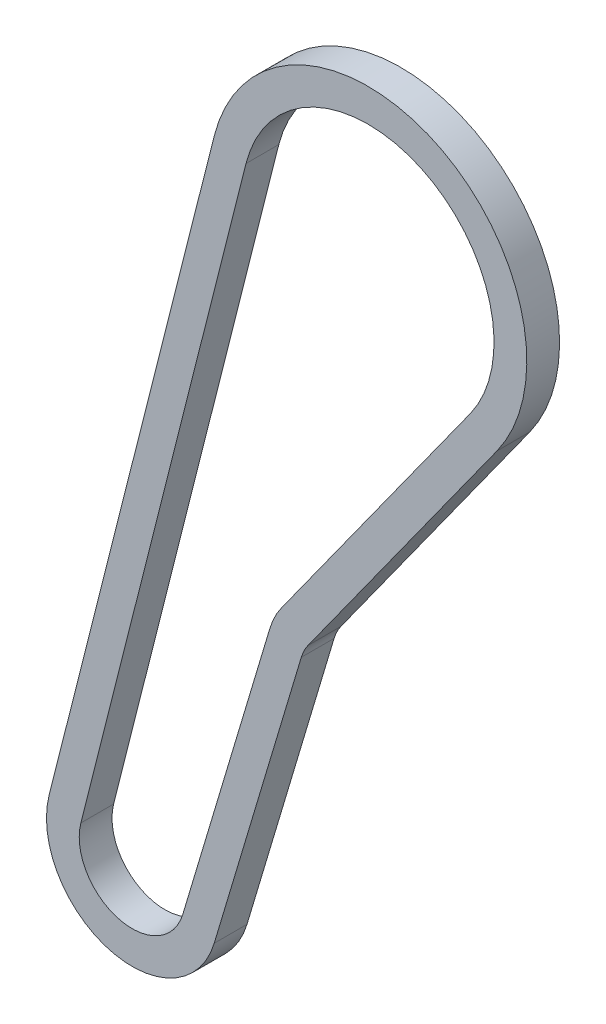
ISO-10303-21;
HEADER;
FILE_DESCRIPTION(('STEP AP214'),'2;1');
FILE_NAME('part.step','',(''),(''),'','','');
FILE_SCHEMA(('AUTOMOTIVE_DESIGN { 1 0 10303 214 1 1 1 1 }'));
ENDSEC;
DATA;
#1=APPLICATION_CONTEXT('core data for automotive mechanical design processes');
#2=APPLICATION_PROTOCOL_DEFINITION('international standard','automotive_design',2000,#1);
#3=PRODUCT_CONTEXT('',#1,'mechanical');
#4=PRODUCT('Part','Part','',(#3));
#5=PRODUCT_RELATED_PRODUCT_CATEGORY('part','',(#4));
#6=PRODUCT_DEFINITION_FORMATION('','',#4);
#7=PRODUCT_DEFINITION_CONTEXT('part definition',#1,'design');
#8=PRODUCT_DEFINITION('design','',#6,#7);
#9=PRODUCT_DEFINITION_SHAPE('','',#8);
#10=(LENGTH_UNIT() NAMED_UNIT(*) SI_UNIT(.MILLI.,.METRE.));
#11=(NAMED_UNIT(*) PLANE_ANGLE_UNIT() SI_UNIT($,.RADIAN.));
#12=(NAMED_UNIT(*) SI_UNIT($,.STERADIAN.) SOLID_ANGLE_UNIT());
#13=UNCERTAINTY_MEASURE_WITH_UNIT(LENGTH_MEASURE(1.E-05),#10,'distance_accuracy_value','');
#14=(GEOMETRIC_REPRESENTATION_CONTEXT(3) GLOBAL_UNCERTAINTY_ASSIGNED_CONTEXT((#13)) GLOBAL_UNIT_ASSIGNED_CONTEXT((#10,
#11,#12)) REPRESENTATION_CONTEXT('',''));
#15=CARTESIAN_POINT('',(0.,0.,0.));
#16=DIRECTION('',(0.,0.,1.));
#17=DIRECTION('',(1.,0.,0.));
#18=AXIS2_PLACEMENT_3D('',#15,#16,#17);
#19=CARTESIAN_POINT('',(5.9299817576051,8.74986950499668,5.));
#20=DIRECTION('',(0.,0.,-1.));
#21=DIRECTION('',(-1.,0.,0.));
#22=AXIS2_PLACEMENT_3D('',#19,#20,#21);
#23=CYLINDRICAL_SURFACE('',#22,13.07);
#24=CARTESIAN_POINT('',(5.9299817576051,8.74986950499668,0.));
#25=DIRECTION('',(0.,0.,-1.));
#26=DIRECTION('',(-1.,0.,0.));
#27=AXIS2_PLACEMENT_3D('',#24,#25,#26);
#28=CIRCLE('',#27,13.07);
#29=CARTESIAN_POINT('',(18.4520314379006,5.00511693583915,0.));
#30=VERTEX_POINT('',#29);
#31=CARTESIAN_POINT('',(-6.74175240365103,11.9517522864948,0.));
#32=VERTEX_POINT('',#31);
#33=EDGE_CURVE('E209',#30,#32,#28,.T.);
#34=ORIENTED_EDGE('',*,*,#33,.F.);
#35=DIRECTION('',(0.,0.,-1.));
#36=VECTOR('',#35,1.);
#37=CARTESIAN_POINT('',(18.4520314379006,5.00511693583915,5.));
#38=LINE('',#37,#36);
#39=CARTESIAN_POINT('',(18.4520314379006,5.00511693583915,5.));
#40=VERTEX_POINT('',#39);
#41=EDGE_CURVE('E12',#40,#30,#38,.T.);
#42=ORIENTED_EDGE('',*,*,#41,.F.);
#43=CARTESIAN_POINT('',(5.9299817576051,8.74986950499668,5.));
#44=DIRECTION('',(0.,0.,-1.));
#45=DIRECTION('',(-1.,0.,0.));
#46=AXIS2_PLACEMENT_3D('',#43,#44,#45);
#47=CIRCLE('',#46,13.07);
#48=CARTESIAN_POINT('',(-6.74175240365103,11.9517522864948,5.));
#49=VERTEX_POINT('',#48);
#50=EDGE_CURVE('E217',#40,#49,#47,.T.);
#51=ORIENTED_EDGE('',*,*,#50,.T.);
#52=DIRECTION('',(0.,0.,-1.));
#53=VECTOR('',#52,1.);
#54=CARTESIAN_POINT('',(-6.74175240365103,11.9517522864948,5.));
#55=LINE('',#54,#53);
#56=EDGE_CURVE('E78',#49,#32,#55,.T.);
#57=ORIENTED_EDGE('',*,*,#56,.T.);
#58=EDGE_LOOP('',(#34,#42,#51,#57));
#59=FACE_BOUND('',#58,.T.);
#60=ADVANCED_FACE('F75',(#59),#23,.T.);
#61=CARTESIAN_POINT('',(31.7371895238046,49.4292561786879,5.));
#62=DIRECTION('',(0.958075721522225,-0.286515116232404,0.));
#63=DIRECTION('',(0.286515116232404,0.958075721522225,0.));
#64=AXIS2_PLACEMENT_3D('',#61,#62,#63);
#65=PLANE('',#64);
#66=DIRECTION('',(-0.286515116232404,-0.958075721522225,0.));
#67=VECTOR('',#66,1.);
#68=CARTESIAN_POINT('',(31.7371895238046,49.4292561786879,0.));
#69=LINE('',#68,#67);
#70=CARTESIAN_POINT('',(31.7371895238046,49.4292561786879,0.));
#71=VERTEX_POINT('',#70);
#72=EDGE_CURVE('E221',#71,#30,#69,.T.);
#73=ORIENTED_EDGE('',*,*,#72,.F.);
#74=DIRECTION('',(0.,0.,-1.));
#75=VECTOR('',#74,1.);
#76=CARTESIAN_POINT('',(31.7371895238046,49.4292561786879,5.));
#77=LINE('',#76,#75);
#78=CARTESIAN_POINT('',(31.7371895238046,49.4292561786879,5.));
#79=VERTEX_POINT('',#78);
#80=EDGE_CURVE('E83',#79,#71,#77,.T.);
#81=ORIENTED_EDGE('',*,*,#80,.F.);
#82=DIRECTION('',(-0.286515116232404,-0.958075721522225,0.));
#83=VECTOR('',#82,1.);
#84=CARTESIAN_POINT('',(31.7371895238046,49.4292561786879,5.));
#85=LINE('',#84,#83);
#86=EDGE_CURVE('E233',#79,#40,#85,.T.);
#87=ORIENTED_EDGE('',*,*,#86,.T.);
#88=ORIENTED_EDGE('',*,*,#41,.T.);
#89=EDGE_LOOP('',(#73,#81,#87,#88));
#90=FACE_BOUND('',#89,.T.);
#91=ADVANCED_FACE('F270',(#90),#65,.T.);
#92=CARTESIAN_POINT('',(38.4437195744602,47.4236503650611,5.));
#93=DIRECTION('',(0.,0.,-1.));
#94=DIRECTION('',(-1.,0.,0.));
#95=AXIS2_PLACEMENT_3D('',#92,#93,#94);
#96=CYLINDRICAL_SURFACE('',#95,7.);
#97=CARTESIAN_POINT('',(38.4437195744602,47.4236503650611,0.));
#98=DIRECTION('',(0.,0.,1.));
#99=DIRECTION('',(1.,0.,0.));
#100=AXIS2_PLACEMENT_3D('',#97,#98,#99);
#101=CIRCLE('',#100,7.);
#102=CARTESIAN_POINT('',(32.7595800865692,51.5090583351662,0.));
#103=VERTEX_POINT('',#102);
#104=EDGE_CURVE('E247',#103,#71,#101,.T.);
#105=ORIENTED_EDGE('',*,*,#104,.F.);
#106=DIRECTION('',(0.,0.,-1.));
#107=VECTOR('',#106,1.);
#108=CARTESIAN_POINT('',(32.7595800865692,51.5090583351662,5.));
#109=LINE('',#108,#107);
#110=CARTESIAN_POINT('',(32.7595800865692,51.5090583351662,5.));
#111=VERTEX_POINT('',#110);
#112=EDGE_CURVE('E253',#111,#103,#109,.T.);
#113=ORIENTED_EDGE('',*,*,#112,.F.);
#114=CARTESIAN_POINT('',(38.4437195744602,47.4236503650611,5.));
#115=DIRECTION('',(0.,0.,1.));
#116=DIRECTION('',(1.,0.,0.));
#117=AXIS2_PLACEMENT_3D('',#114,#115,#116);
#118=CIRCLE('',#117,7.);
#119=EDGE_CURVE('E230',#111,#79,#118,.T.);
#120=ORIENTED_EDGE('',*,*,#119,.T.);
#121=ORIENTED_EDGE('',*,*,#80,.T.);
#122=EDGE_LOOP('',(#105,#113,#120,#121));
#123=FACE_BOUND('',#122,.T.);
#124=ADVANCED_FACE('F281',(#123),#96,.F.);
#125=CARTESIAN_POINT('',(61.5889841864478,91.6201942255349,5.));
#126=DIRECTION('',(0.812019926841562,-0.583629710015027,0.));
#127=DIRECTION('',(0.583629710015027,0.812019926841562,0.));
#128=AXIS2_PLACEMENT_3D('',#125,#126,#127);
#129=PLANE('',#128);
#130=DIRECTION('',(-0.583629710015027,-0.812019926841562,0.));
#131=VECTOR('',#130,1.);
#132=CARTESIAN_POINT('',(61.5889841864478,91.6201942255349,0.));
#133=LINE('',#132,#131);
#134=CARTESIAN_POINT('',(61.5889841864477,91.6201942255349,0.));
#135=VERTEX_POINT('',#134);
#136=EDGE_CURVE('E244',#135,#103,#133,.T.);
#137=ORIENTED_EDGE('',*,*,#136,.F.);
#138=DIRECTION('',(0.,0.,-1.));
#139=VECTOR('',#138,1.);
#140=CARTESIAN_POINT('',(61.5889841864477,91.6201942255349,5.));
#141=LINE('',#140,#139);
#142=CARTESIAN_POINT('',(61.5889841864477,91.6201942255349,5.));
#143=VERTEX_POINT('',#142);
#144=EDGE_CURVE('E255',#143,#135,#141,.T.);
#145=ORIENTED_EDGE('',*,*,#144,.F.);
#146=DIRECTION('',(-0.583629710015027,-0.812019926841562,0.));
#147=VECTOR('',#146,1.);
#148=CARTESIAN_POINT('',(61.5889841864478,91.6201942255349,5.));
#149=LINE('',#148,#147);
#150=EDGE_CURVE('E227',#143,#111,#149,.T.);
#151=ORIENTED_EDGE('',*,*,#150,.T.);
#152=ORIENTED_EDGE('',*,*,#112,.T.);
#153=EDGE_LOOP('',(#137,#145,#151,#152));
#154=FACE_BOUND('',#153,.T.);
#155=ADVANCED_FACE('F279',(#154),#129,.T.);
#156=CARTESIAN_POINT('',(41.9299817576135,105.749869504999,5.));
#157=DIRECTION('',(0.,0.,-1.));
#158=DIRECTION('',(-1.,0.,0.));
#159=AXIS2_PLACEMENT_3D('',#156,#157,#158);
#160=CYLINDRICAL_SURFACE('',#159,24.21);
#161=CARTESIAN_POINT('',(41.9299817576135,105.749869504999,0.));
#162=DIRECTION('',(0.,0.,-1.));
#163=DIRECTION('',(-1.,0.,0.));
#164=AXIS2_PLACEMENT_3D('',#161,#162,#163);
#165=CIRCLE('',#164,24.21);
#166=CARTESIAN_POINT('',(18.4577029478193,111.680824527192,0.));
#167=VERTEX_POINT('',#166);
#168=EDGE_CURVE('E241',#167,#135,#165,.T.);
#169=ORIENTED_EDGE('',*,*,#168,.F.);
#170=DIRECTION('',(0.,0.,-1.));
#171=VECTOR('',#170,1.);
#172=CARTESIAN_POINT('',(18.4577029478193,111.680824527192,5.));
#173=LINE('',#172,#171);
#174=CARTESIAN_POINT('',(18.4577029478193,111.680824527192,5.));
#175=VERTEX_POINT('',#174);
#176=EDGE_CURVE('E256',#175,#167,#173,.T.);
#177=ORIENTED_EDGE('',*,*,#176,.F.);
#178=CARTESIAN_POINT('',(41.9299817576135,105.749869504999,5.));
#179=DIRECTION('',(0.,0.,-1.));
#180=DIRECTION('',(-1.,0.,0.));
#181=AXIS2_PLACEMENT_3D('',#178,#179,#180);
#182=CIRCLE('',#181,24.21);
#183=EDGE_CURVE('E224',#175,#143,#182,.T.);
#184=ORIENTED_EDGE('',*,*,#183,.T.);
#185=ORIENTED_EDGE('',*,*,#144,.T.);
#186=EDGE_LOOP('',(#169,#177,#184,#185));
#187=FACE_BOUND('',#186,.T.);
#188=ADVANCED_FACE('F276',(#187),#160,.T.);
#189=CARTESIAN_POINT('',(-6.74175240365103,11.9517522864948,5.));
#190=DIRECTION('',(-0.969528244931609,0.244979554820058,0.));
#191=DIRECTION('',(-0.244979554820058,-0.969528244931609,0.));
#192=AXIS2_PLACEMENT_3D('',#189,#190,#191);
#193=PLANE('',#192);
#194=DIRECTION('',(0.244979554820058,0.969528244931609,0.));
#195=VECTOR('',#194,1.);
#196=CARTESIAN_POINT('',(-6.74175240365103,11.9517522864948,0.));
#197=LINE('',#196,#195);
#198=EDGE_CURVE('E238',#32,#167,#197,.T.);
#199=ORIENTED_EDGE('',*,*,#198,.F.);
#200=ORIENTED_EDGE('',*,*,#56,.F.);
#201=DIRECTION('',(0.244979554820058,0.969528244931609,0.));
#202=VECTOR('',#201,1.);
#203=CARTESIAN_POINT('',(-6.74175240365103,11.9517522864948,5.));
#204=LINE('',#203,#202);
#205=EDGE_CURVE('E220',#49,#175,#204,.T.);
#206=ORIENTED_EDGE('',*,*,#205,.T.);
#207=ORIENTED_EDGE('',*,*,#176,.T.);
#208=EDGE_LOOP('',(#199,#200,#206,#207));
#209=FACE_BOUND('',#208,.T.);
#210=ADVANCED_FACE('F264',(#209),#193,.T.);
#211=CARTESIAN_POINT('',(5.9299817576051,8.74986950499668,5.));
#212=DIRECTION('',(0.,0.,-1.));
#213=DIRECTION('',(-1.,0.,0.));
#214=AXIS2_PLACEMENT_3D('',#211,#212,#213);
#215=PLANE('',#214);
#216=DIRECTION('',(-0.286515116232404,-0.958075721522225,0.));
#217=VECTOR('',#216,1.);
#218=CARTESIAN_POINT('',(13.6616528302895,6.43769251700117,5.));
#219=LINE('',#218,#217);
#220=CARTESIAN_POINT('',(26.9468109161935,50.8618317598499,5.));
#221=VERTEX_POINT('',#220);
#222=CARTESIAN_POINT('',(13.6616528302895,6.43769251700117,5.));
#223=VERTEX_POINT('',#222);
#224=EDGE_CURVE('E172',#221,#223,#219,.T.);
#225=ORIENTED_EDGE('',*,*,#224,.T.);
#226=CARTESIAN_POINT('',(5.9299817576051,8.74986950499668,5.));
#227=DIRECTION('',(0.,0.,-1.));
#228=DIRECTION('',(-1.,0.,0.));
#229=AXIS2_PLACEMENT_3D('',#226,#227,#228);
#230=CIRCLE('',#229,8.07);
#231=CARTESIAN_POINT('',(-1.89411117899299,10.7268545123945,5.));
#232=VERTEX_POINT('',#231);
#233=EDGE_CURVE('E166',#223,#232,#230,.T.);
#234=ORIENTED_EDGE('',*,*,#233,.T.);
#235=DIRECTION('',(0.244979554820058,0.969528244931609,0.));
#236=VECTOR('',#235,1.);
#237=CARTESIAN_POINT('',(-1.89411117899299,10.7268545123945,5.));
#238=LINE('',#237,#236);
#239=CARTESIAN_POINT('',(23.3053441724773,110.455926753092,5.));
#240=VERTEX_POINT('',#239);
#241=EDGE_CURVE('E175',#232,#240,#238,.T.);
#242=ORIENTED_EDGE('',*,*,#241,.T.);
#243=CARTESIAN_POINT('',(41.9299817576135,105.749869504999,5.));
#244=DIRECTION('',(0.,0.,-1.));
#245=DIRECTION('',(-1.,0.,0.));
#246=AXIS2_PLACEMENT_3D('',#243,#244,#245);
#247=CIRCLE('',#246,19.21);
#248=CARTESIAN_POINT('',(57.5288845522399,94.53834277561,5.));
#249=VERTEX_POINT('',#248);
#250=EDGE_CURVE('E91',#240,#249,#247,.T.);
#251=ORIENTED_EDGE('',*,*,#250,.T.);
#252=DIRECTION('',(-0.583629710015027,-0.812019926841562,0.));
#253=VECTOR('',#252,1.);
#254=CARTESIAN_POINT('',(-0.703705010213456,13.5177533421477,5.));
#255=LINE('',#254,#253);
#256=CARTESIAN_POINT('',(28.6994804523614,54.4272068852414,5.));
#257=VERTEX_POINT('',#256);
#258=EDGE_CURVE('E190',#249,#257,#255,.T.);
#259=ORIENTED_EDGE('',*,*,#258,.T.);
#260=CARTESIAN_POINT('',(38.4437195744602,47.4236503650611,5.));
#261=DIRECTION('',(0.,0.,-1.));
#262=DIRECTION('',(-1.,0.,0.));
#263=AXIS2_PLACEMENT_3D('',#260,#261,#262);
#264=CIRCLE('',#263,12.);
#265=EDGE_CURVE('E193',#257,#221,#264,.F.);
#266=ORIENTED_EDGE('',*,*,#265,.T.);
#267=EDGE_LOOP('',(#225,#234,#242,#251,#259,#266));
#268=FACE_BOUND('',#267,.T.);
#269=ORIENTED_EDGE('',*,*,#50,.F.);
#270=ORIENTED_EDGE('',*,*,#86,.F.);
#271=ORIENTED_EDGE('',*,*,#119,.F.);
#272=ORIENTED_EDGE('',*,*,#150,.F.);
#273=ORIENTED_EDGE('',*,*,#183,.F.);
#274=ORIENTED_EDGE('',*,*,#205,.F.);
#275=EDGE_LOOP('',(#269,#270,#271,#272,#273,#274));
#276=FACE_BOUND('',#275,.T.);
#277=ADVANCED_FACE('F179',(#268,#276),#215,.F.);
#278=CARTESIAN_POINT('',(5.9299817576051,8.74986950499668,0.));
#279=DIRECTION('',(0.,0.,-1.));
#280=DIRECTION('',(-1.,0.,0.));
#281=AXIS2_PLACEMENT_3D('',#278,#279,#280);
#282=PLANE('',#281);
#283=CARTESIAN_POINT('',(5.9299817576051,8.74986950499668,0.));
#284=DIRECTION('',(0.,0.,-1.));
#285=DIRECTION('',(-1.,0.,0.));
#286=AXIS2_PLACEMENT_3D('',#283,#284,#285);
#287=CIRCLE('',#286,8.07);
#288=CARTESIAN_POINT('',(13.6616528302895,6.43769251700117,0.));
#289=VERTEX_POINT('',#288);
#290=CARTESIAN_POINT('',(-1.89411117899299,10.7268545123945,0.));
#291=VERTEX_POINT('',#290);
#292=EDGE_CURVE('E99',#289,#291,#287,.T.);
#293=ORIENTED_EDGE('',*,*,#292,.F.);
#294=DIRECTION('',(-0.286515116232404,-0.958075721522225,0.));
#295=VECTOR('',#294,1.);
#296=CARTESIAN_POINT('',(13.6616528302895,6.43769251700117,0.));
#297=LINE('',#296,#295);
#298=CARTESIAN_POINT('',(26.9468109161935,50.8618317598499,0.));
#299=VERTEX_POINT('',#298);
#300=EDGE_CURVE('E183',#299,#289,#297,.T.);
#301=ORIENTED_EDGE('',*,*,#300,.F.);
#302=CARTESIAN_POINT('',(38.4437195744602,47.4236503650611,0.));
#303=DIRECTION('',(0.,0.,-1.));
#304=DIRECTION('',(-1.,0.,0.));
#305=AXIS2_PLACEMENT_3D('',#302,#303,#304);
#306=CIRCLE('',#305,12.);
#307=CARTESIAN_POINT('',(28.6994804523614,54.4272068852414,0.));
#308=VERTEX_POINT('',#307);
#309=EDGE_CURVE('E186',#308,#299,#306,.F.);
#310=ORIENTED_EDGE('',*,*,#309,.F.);
#311=DIRECTION('',(-0.583629710015027,-0.812019926841562,0.));
#312=VECTOR('',#311,1.);
#313=CARTESIAN_POINT('',(-0.703705010213456,13.5177533421477,0.));
#314=LINE('',#313,#312);
#315=CARTESIAN_POINT('',(57.5288845522399,94.53834277561,0.));
#316=VERTEX_POINT('',#315);
#317=EDGE_CURVE('E202',#316,#308,#314,.T.);
#318=ORIENTED_EDGE('',*,*,#317,.F.);
#319=CARTESIAN_POINT('',(41.9299817576135,105.749869504999,0.));
#320=DIRECTION('',(0.,0.,-1.));
#321=DIRECTION('',(-1.,0.,0.));
#322=AXIS2_PLACEMENT_3D('',#319,#320,#321);
#323=CIRCLE('',#322,19.21);
#324=CARTESIAN_POINT('',(23.3053441724773,110.455926753092,0.));
#325=VERTEX_POINT('',#324);
#326=EDGE_CURVE('E199',#325,#316,#323,.T.);
#327=ORIENTED_EDGE('',*,*,#326,.F.);
#328=DIRECTION('',(0.244979554820058,0.969528244931609,0.));
#329=VECTOR('',#328,1.);
#330=CARTESIAN_POINT('',(-1.89411117899299,10.7268545123945,0.));
#331=LINE('',#330,#329);
#332=EDGE_CURVE('E197',#291,#325,#331,.T.);
#333=ORIENTED_EDGE('',*,*,#332,.F.);
#334=EDGE_LOOP('',(#293,#301,#310,#318,#327,#333));
#335=FACE_BOUND('',#334,.T.);
#336=ORIENTED_EDGE('',*,*,#33,.T.);
#337=ORIENTED_EDGE('',*,*,#198,.T.);
#338=ORIENTED_EDGE('',*,*,#168,.T.);
#339=ORIENTED_EDGE('',*,*,#136,.T.);
#340=ORIENTED_EDGE('',*,*,#104,.T.);
#341=ORIENTED_EDGE('',*,*,#72,.T.);
#342=EDGE_LOOP('',(#336,#337,#338,#339,#340,#341));
#343=FACE_BOUND('',#342,.T.);
#344=ADVANCED_FACE('F266',(#335,#343),#282,.T.);
#345=CARTESIAN_POINT('',(5.9299817576051,8.74986950499668,5.));
#346=DIRECTION('',(0.,0.,-1.));
#347=DIRECTION('',(-1.,0.,0.));
#348=AXIS2_PLACEMENT_3D('',#345,#346,#347);
#349=CYLINDRICAL_SURFACE('',#348,8.07);
#350=ORIENTED_EDGE('',*,*,#292,.T.);
#351=DIRECTION('',(0.,0.,-1.));
#352=VECTOR('',#351,1.);
#353=CARTESIAN_POINT('',(-1.89411117899299,10.7268545123945,5.));
#354=LINE('',#353,#352);
#355=EDGE_CURVE('E162',#232,#291,#354,.T.);
#356=ORIENTED_EDGE('',*,*,#355,.F.);
#357=ORIENTED_EDGE('',*,*,#233,.F.);
#358=DIRECTION('',(0.,0.,-1.));
#359=VECTOR('',#358,1.);
#360=CARTESIAN_POINT('',(13.6616528302895,6.43769251700117,5.));
#361=LINE('',#360,#359);
#362=EDGE_CURVE('E207',#223,#289,#361,.T.);
#363=ORIENTED_EDGE('',*,*,#362,.T.);
#364=EDGE_LOOP('',(#350,#356,#357,#363));
#365=FACE_BOUND('',#364,.T.);
#366=ADVANCED_FACE('F164',(#365),#349,.F.);
#367=CARTESIAN_POINT('',(13.6616528302895,6.43769251700117,5.));
#368=DIRECTION('',(0.958075721522225,-0.286515116232404,0.));
#369=DIRECTION('',(0.286515116232404,0.958075721522225,0.));
#370=AXIS2_PLACEMENT_3D('',#367,#368,#369);
#371=PLANE('',#370);
#372=ORIENTED_EDGE('',*,*,#300,.T.);
#373=ORIENTED_EDGE('',*,*,#362,.F.);
#374=ORIENTED_EDGE('',*,*,#224,.F.);
#375=DIRECTION('',(0.,0.,-1.));
#376=VECTOR('',#375,1.);
#377=CARTESIAN_POINT('',(26.9468109161935,50.8618317598499,5.));
#378=LINE('',#377,#376);
#379=EDGE_CURVE('E210',#221,#299,#378,.T.);
#380=ORIENTED_EDGE('',*,*,#379,.T.);
#381=EDGE_LOOP('',(#372,#373,#374,#380));
#382=FACE_BOUND('',#381,.T.);
#383=ADVANCED_FACE('F350',(#382),#371,.F.);
#384=CARTESIAN_POINT('',(38.4437195744602,47.4236503650611,5.));
#385=DIRECTION('',(0.,0.,-1.));
#386=DIRECTION('',(-1.,0.,0.));
#387=AXIS2_PLACEMENT_3D('',#384,#385,#386);
#388=CYLINDRICAL_SURFACE('',#387,12.);
#389=ORIENTED_EDGE('',*,*,#309,.T.);
#390=ORIENTED_EDGE('',*,*,#379,.F.);
#391=ORIENTED_EDGE('',*,*,#265,.F.);
#392=DIRECTION('',(0.,0.,-1.));
#393=VECTOR('',#392,1.);
#394=CARTESIAN_POINT('',(28.6994804523614,54.4272068852414,5.));
#395=LINE('',#394,#393);
#396=EDGE_CURVE('E212',#257,#308,#395,.T.);
#397=ORIENTED_EDGE('',*,*,#396,.T.);
#398=EDGE_LOOP('',(#389,#390,#391,#397));
#399=FACE_BOUND('',#398,.T.);
#400=ADVANCED_FACE('F359',(#399),#388,.T.);
#401=CARTESIAN_POINT('',(-0.703705010213456,13.5177533421477,5.));
#402=DIRECTION('',(0.812019926841562,-0.583629710015027,0.));
#403=DIRECTION('',(0.583629710015027,0.812019926841562,0.));
#404=AXIS2_PLACEMENT_3D('',#401,#402,#403);
#405=PLANE('',#404);
#406=ORIENTED_EDGE('',*,*,#317,.T.);
#407=ORIENTED_EDGE('',*,*,#396,.F.);
#408=ORIENTED_EDGE('',*,*,#258,.F.);
#409=DIRECTION('',(0.,0.,-1.));
#410=VECTOR('',#409,1.);
#411=CARTESIAN_POINT('',(57.5288845522399,94.53834277561,5.));
#412=LINE('',#411,#410);
#413=EDGE_CURVE('E214',#249,#316,#412,.T.);
#414=ORIENTED_EDGE('',*,*,#413,.T.);
#415=EDGE_LOOP('',(#406,#407,#408,#414));
#416=FACE_BOUND('',#415,.T.);
#417=ADVANCED_FACE('F369',(#416),#405,.F.);
#418=CARTESIAN_POINT('',(41.9299817576135,105.749869504999,5.));
#419=DIRECTION('',(0.,0.,-1.));
#420=DIRECTION('',(-1.,0.,0.));
#421=AXIS2_PLACEMENT_3D('',#418,#419,#420);
#422=CYLINDRICAL_SURFACE('',#421,19.21);
#423=ORIENTED_EDGE('',*,*,#326,.T.);
#424=ORIENTED_EDGE('',*,*,#413,.F.);
#425=ORIENTED_EDGE('',*,*,#250,.F.);
#426=DIRECTION('',(0.,0.,-1.));
#427=VECTOR('',#426,1.);
#428=CARTESIAN_POINT('',(23.3053441724773,110.455926753092,5.));
#429=LINE('',#428,#427);
#430=EDGE_CURVE('E171',#240,#325,#429,.T.);
#431=ORIENTED_EDGE('',*,*,#430,.T.);
#432=EDGE_LOOP('',(#423,#424,#425,#431));
#433=FACE_BOUND('',#432,.T.);
#434=ADVANCED_FACE('F379',(#433),#422,.F.);
#435=CARTESIAN_POINT('',(-1.89411117899299,10.7268545123945,5.));
#436=DIRECTION('',(-0.969528244931609,0.244979554820058,0.));
#437=DIRECTION('',(-0.244979554820058,-0.969528244931609,0.));
#438=AXIS2_PLACEMENT_3D('',#435,#436,#437);
#439=PLANE('',#438);
#440=ORIENTED_EDGE('',*,*,#332,.T.);
#441=ORIENTED_EDGE('',*,*,#430,.F.);
#442=ORIENTED_EDGE('',*,*,#241,.F.);
#443=ORIENTED_EDGE('',*,*,#355,.T.);
#444=EDGE_LOOP('',(#440,#441,#442,#443));
#445=FACE_BOUND('',#444,.T.);
#446=ADVANCED_FACE('F176',(#445),#439,.F.);
#447=CLOSED_SHELL('',(#60,#91,#124,#155,#188,#210,#277,#344,#366,#383,#400,#417,#434,#446));
#448=MANIFOLD_SOLID_BREP('B2',#447);
#449=ADVANCED_BREP_SHAPE_REPRESENTATION('',(#18,#448),#14);
#450=SHAPE_DEFINITION_REPRESENTATION(#9,#449);
ENDSEC;
END-ISO-10303-21;
